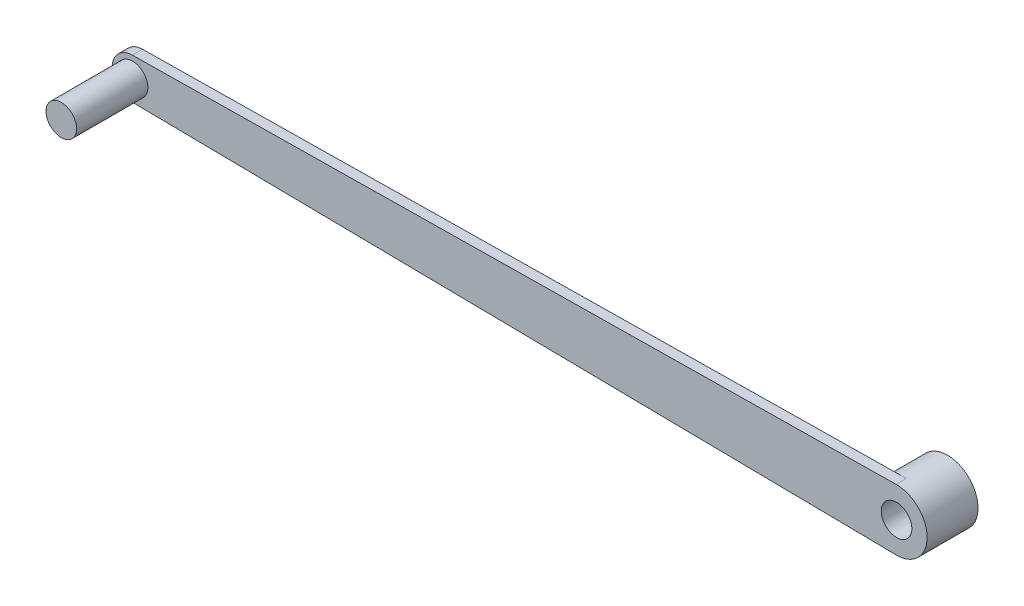
ISO-10303-21;
HEADER;
FILE_DESCRIPTION(('STEP AP214'),'2;1');
FILE_NAME('part.step','',(''),(''),'','','');
FILE_SCHEMA(('AUTOMOTIVE_DESIGN { 1 0 10303 214 1 1 1 1 }'));
ENDSEC;
DATA;
#1=APPLICATION_CONTEXT('core data for automotive mechanical design processes');
#2=APPLICATION_PROTOCOL_DEFINITION('international standard','automotive_design',2000,#1);
#3=PRODUCT_CONTEXT('',#1,'mechanical');
#4=PRODUCT('Part','Part','',(#3));
#5=PRODUCT_RELATED_PRODUCT_CATEGORY('part','',(#4));
#6=PRODUCT_DEFINITION_FORMATION('','',#4);
#7=PRODUCT_DEFINITION_CONTEXT('part definition',#1,'design');
#8=PRODUCT_DEFINITION('design','',#6,#7);
#9=PRODUCT_DEFINITION_SHAPE('','',#8);
#10=(LENGTH_UNIT() NAMED_UNIT(*) SI_UNIT(.MILLI.,.METRE.));
#11=(NAMED_UNIT(*) PLANE_ANGLE_UNIT() SI_UNIT($,.RADIAN.));
#12=(NAMED_UNIT(*) SI_UNIT($,.STERADIAN.) SOLID_ANGLE_UNIT());
#13=UNCERTAINTY_MEASURE_WITH_UNIT(LENGTH_MEASURE(1.E-05),#10,'distance_accuracy_value','');
#14=(GEOMETRIC_REPRESENTATION_CONTEXT(3) GLOBAL_UNCERTAINTY_ASSIGNED_CONTEXT((#13)) GLOBAL_UNIT_ASSIGNED_CONTEXT((#10,
#11,#12)) REPRESENTATION_CONTEXT('',''));
#15=CARTESIAN_POINT('',(0.,0.,0.));
#16=DIRECTION('',(0.,0.,1.));
#17=DIRECTION('',(1.,0.,0.));
#18=AXIS2_PLACEMENT_3D('',#15,#16,#17);
#19=CARTESIAN_POINT('',(-77.46176,-3.035730121,0.));
#20=DIRECTION('',(0.,0.,1.));
#21=DIRECTION('',(1.,0.,0.));
#22=AXIS2_PLACEMENT_3D('',#19,#20,#21);
#23=PLANE('',#22);
#24=DIRECTION('',(-0.999911107160172,0.013333333331139,0.));
#25=VECTOR('',#24,1.);
#26=CARTESIAN_POINT('',(-37.5333333335,-2.4997777675,0.));
#27=LINE('',#26,#25);
#28=CARTESIAN_POINT('',(-0.0400000002764414,-2.99973332123653,0.));
#29=VERTEX_POINT('',#28);
#30=CARTESIAN_POINT('',(-75.0266666668291,-1.99982221400228,0.));
#31=VERTEX_POINT('',#30);
#32=EDGE_CURVE('E66',#29,#31,#27,.T.);
#33=ORIENTED_EDGE('',*,*,#32,.T.);
#34=CARTESIAN_POINT('',(-75.,0.,0.));
#35=DIRECTION('',(0.,0.,-1.));
#36=DIRECTION('',(-1.,0.,0.));
#37=AXIS2_PLACEMENT_3D('',#34,#35,#36);
#38=CIRCLE('',#37,2.);
#39=CARTESIAN_POINT('',(-75.026666666829,1.99982221400228,0.));
#40=VERTEX_POINT('',#39);
#41=EDGE_CURVE('E21',#31,#40,#38,.T.);
#42=ORIENTED_EDGE('',*,*,#41,.T.);
#43=DIRECTION('',(0.999911107160172,0.013333333331139,0.));
#44=VECTOR('',#43,1.);
#45=CARTESIAN_POINT('',(-37.5333333335,2.4997777675,0.));
#46=LINE('',#45,#44);
#47=CARTESIAN_POINT('',(-0.039999999993506,2.99973332100009,0.));
#48=VERTEX_POINT('',#47);
#49=EDGE_CURVE('E81',#40,#48,#46,.T.);
#50=ORIENTED_EDGE('',*,*,#49,.T.);
#51=CARTESIAN_POINT('',(0.,0.,0.));
#52=DIRECTION('',(0.,0.,-1.));
#53=DIRECTION('',(-1.,0.,0.));
#54=AXIS2_PLACEMENT_3D('',#51,#52,#53);
#55=CIRCLE('',#54,3.);
#56=EDGE_CURVE('E67',#48,#29,#55,.F.);
#57=ORIENTED_EDGE('',*,*,#56,.T.);
#58=EDGE_LOOP('',(#33,#42,#50,#57));
#59=FACE_BOUND('',#58,.T.);
#60=ADVANCED_FACE('F17',(#59),#23,.F.);
#61=CARTESIAN_POINT('',(3.036,-3.036,-4.));
#62=DIRECTION('',(0.,0.,-1.));
#63=DIRECTION('',(-1.,0.,0.));
#64=AXIS2_PLACEMENT_3D('',#61,#62,#63);
#65=PLANE('',#64);
#66=CARTESIAN_POINT('',(0.,0.,-4.));
#67=DIRECTION('',(0.,0.,-1.));
#68=DIRECTION('',(-1.,0.,0.));
#69=AXIS2_PLACEMENT_3D('',#66,#67,#68);
#70=CIRCLE('',#69,1.5);
#71=CARTESIAN_POINT('',(-1.5,0.,-4.));
#72=VERTEX_POINT('',#71);
#73=EDGE_CURVE('E82',#72,#72,#70,.T.);
#74=ORIENTED_EDGE('',*,*,#73,.F.);
#75=EDGE_LOOP('',(#74));
#76=FACE_BOUND('',#75,.T.);
#77=CARTESIAN_POINT('',(0.,0.,-4.));
#78=DIRECTION('',(0.,0.,-1.));
#79=DIRECTION('',(-1.,0.,0.));
#80=AXIS2_PLACEMENT_3D('',#77,#78,#79);
#81=CIRCLE('',#80,3.);
#82=CARTESIAN_POINT('',(-3.,0.,-4.));
#83=VERTEX_POINT('',#82);
#84=EDGE_CURVE('E100',#83,#83,#81,.T.);
#85=ORIENTED_EDGE('',*,*,#84,.T.);
#86=EDGE_LOOP('',(#85));
#87=FACE_BOUND('',#86,.T.);
#88=ADVANCED_FACE('F134',(#76,#87),#65,.T.);
#89=CARTESIAN_POINT('',(-75.,0.,1.));
#90=DIRECTION('',(0.,0.,-1.));
#91=DIRECTION('',(-1.,0.,0.));
#92=AXIS2_PLACEMENT_3D('',#89,#90,#91);
#93=CYLINDRICAL_SURFACE('',#92,2.);
#94=CARTESIAN_POINT('',(-75.,0.,1.));
#95=DIRECTION('',(0.,0.,-1.));
#96=DIRECTION('',(-1.,0.,0.));
#97=AXIS2_PLACEMENT_3D('',#94,#95,#96);
#98=CIRCLE('',#97,2.);
#99=CARTESIAN_POINT('',(-75.0266666668272,1.99982221562365,1.));
#100=VERTEX_POINT('',#99);
#101=CARTESIAN_POINT('',(-75.0266666668272,-1.99982221562365,1.));
#102=VERTEX_POINT('',#101);
#103=EDGE_CURVE('E96',#100,#102,#98,.F.);
#104=ORIENTED_EDGE('',*,*,#103,.F.);
#105=DIRECTION('',(0.,0.,-1.));
#106=VECTOR('',#105,1.);
#107=CARTESIAN_POINT('',(-75.026666667,1.999822214,0.5));
#108=LINE('',#107,#106);
#109=EDGE_CURVE('E61',#100,#40,#108,.T.);
#110=ORIENTED_EDGE('',*,*,#109,.T.);
#111=ORIENTED_EDGE('',*,*,#41,.F.);
#112=DIRECTION('',(0.,0.,1.));
#113=VECTOR('',#112,1.);
#114=CARTESIAN_POINT('',(-75.026666667,-1.999822214,0.5));
#115=LINE('',#114,#113);
#116=EDGE_CURVE('E58',#31,#102,#115,.T.);
#117=ORIENTED_EDGE('',*,*,#116,.T.);
#118=EDGE_LOOP('',(#104,#110,#111,#117));
#119=FACE_BOUND('',#118,.T.);
#120=ADVANCED_FACE('F56',(#119),#93,.T.);
#121=CARTESIAN_POINT('',(-0.04,-2.999733321,0.));
#122=DIRECTION('',(0.013333333331139,0.999911107160172,0.));
#123=DIRECTION('',(-0.999911107160172,0.013333333331139,0.));
#124=AXIS2_PLACEMENT_3D('',#121,#122,#123);
#125=PLANE('',#124);
#126=DIRECTION('',(0.,0.,-1.));
#127=VECTOR('',#126,1.);
#128=CARTESIAN_POINT('',(-0.0400000005658708,-2.99973332147288,-1.5));
#129=LINE('',#128,#127);
#130=CARTESIAN_POINT('',(-0.0400000002511847,-2.99973332197927,1.));
#131=VERTEX_POINT('',#130);
#132=EDGE_CURVE('E71',#29,#131,#129,.F.);
#133=ORIENTED_EDGE('',*,*,#132,.T.);
#134=DIRECTION('',(0.999911107160484,-0.0133333333077027,0.));
#135=VECTOR('',#134,1.);
#136=CARTESIAN_POINT('',(-75.0266666912,-1.99982221692,1.));
#137=LINE('',#136,#135);
#138=EDGE_CURVE('E75',#102,#131,#137,.T.);
#139=ORIENTED_EDGE('',*,*,#138,.F.);
#140=ORIENTED_EDGE('',*,*,#116,.F.);
#141=ORIENTED_EDGE('',*,*,#32,.F.);
#142=EDGE_LOOP('',(#133,#139,#140,#141));
#143=FACE_BOUND('',#142,.T.);
#144=ADVANCED_FACE('F73',(#143),#125,.F.);
#145=CARTESIAN_POINT('',(0.,0.,1.));
#146=DIRECTION('',(0.,0.,-1.));
#147=DIRECTION('',(-1.,0.,0.));
#148=AXIS2_PLACEMENT_3D('',#145,#146,#147);
#149=CYLINDRICAL_SURFACE('',#148,3.);
#150=ORIENTED_EDGE('',*,*,#84,.F.);
#151=EDGE_LOOP('',(#150));
#152=FACE_BOUND('',#151,.T.);
#153=CARTESIAN_POINT('',(0.,0.,1.));
#154=DIRECTION('',(0.,0.,-1.));
#155=DIRECTION('',(-1.,0.,0.));
#156=AXIS2_PLACEMENT_3D('',#153,#154,#155);
#157=CIRCLE('',#156,3.);
#158=CARTESIAN_POINT('',(-0.0399999999682493,2.99973332174283,1.));
#159=VERTEX_POINT('',#158);
#160=EDGE_CURVE('E92',#131,#159,#157,.F.);
#161=ORIENTED_EDGE('',*,*,#160,.F.);
#162=ORIENTED_EDGE('',*,*,#132,.F.);
#163=ORIENTED_EDGE('',*,*,#56,.F.);
#164=DIRECTION('',(0.,0.,1.));
#165=VECTOR('',#164,1.);
#166=CARTESIAN_POINT('',(-0.04,2.999733321,0.5));
#167=LINE('',#166,#165);
#168=EDGE_CURVE('E36',#48,#159,#167,.T.);
#169=ORIENTED_EDGE('',*,*,#168,.T.);
#170=EDGE_LOOP('',(#161,#162,#163,#169));
#171=FACE_BOUND('',#170,.T.);
#172=ADVANCED_FACE('F109',(#152,#171),#149,.T.);
#173=CARTESIAN_POINT('',(-75.026666667,1.999822214,0.));
#174=DIRECTION('',(0.013333333331139,-0.999911107160172,0.));
#175=DIRECTION('',(0.999911107160172,0.013333333331139,0.));
#176=AXIS2_PLACEMENT_3D('',#173,#174,#175);
#177=PLANE('',#176);
#178=ORIENTED_EDGE('',*,*,#109,.F.);
#179=DIRECTION('',(-0.999911107160484,-0.0133333333077027,0.));
#180=VECTOR('',#179,1.);
#181=CARTESIAN_POINT('',(-0.0400000105599957,2.999733322344,1.));
#182=LINE('',#181,#180);
#183=EDGE_CURVE('E89',#159,#100,#182,.T.);
#184=ORIENTED_EDGE('',*,*,#183,.F.);
#185=ORIENTED_EDGE('',*,*,#168,.F.);
#186=ORIENTED_EDGE('',*,*,#49,.F.);
#187=EDGE_LOOP('',(#178,#184,#185,#186));
#188=FACE_BOUND('',#187,.T.);
#189=ADVANCED_FACE('F105',(#188),#177,.F.);
#190=CARTESIAN_POINT('',(0.,0.,1.));
#191=DIRECTION('',(0.,0.,-1.));
#192=DIRECTION('',(-1.,0.,0.));
#193=AXIS2_PLACEMENT_3D('',#190,#191,#192);
#194=CYLINDRICAL_SURFACE('',#193,1.5);
#195=CARTESIAN_POINT('',(0.,0.,1.));
#196=DIRECTION('',(0.,0.,-1.));
#197=DIRECTION('',(-1.,0.,0.));
#198=AXIS2_PLACEMENT_3D('',#195,#196,#197);
#199=CIRCLE('',#198,1.5);
#200=CARTESIAN_POINT('',(-1.5,0.,1.));
#201=VERTEX_POINT('',#200);
#202=EDGE_CURVE('E86',#201,#201,#199,.T.);
#203=ORIENTED_EDGE('',*,*,#202,.F.);
#204=EDGE_LOOP('',(#203));
#205=FACE_BOUND('',#204,.T.);
#206=ORIENTED_EDGE('',*,*,#73,.T.);
#207=EDGE_LOOP('',(#206));
#208=FACE_BOUND('',#207,.T.);
#209=ADVANCED_FACE('F108',(#205,#208),#194,.F.);
#210=CARTESIAN_POINT('',(-77.48,-3.036,1.));
#211=DIRECTION('',(0.,0.,1.));
#212=DIRECTION('',(1.,0.,0.));
#213=AXIS2_PLACEMENT_3D('',#210,#211,#212);
#214=PLANE('',#213);
#215=CARTESIAN_POINT('',(-75.,0.,1.));
#216=DIRECTION('',(0.,0.,-1.));
#217=DIRECTION('',(-1.,0.,0.));
#218=AXIS2_PLACEMENT_3D('',#215,#216,#217);
#219=CIRCLE('',#218,1.5);
#220=CARTESIAN_POINT('',(-76.5,0.,1.));
#221=VERTEX_POINT('',#220);
#222=EDGE_CURVE('E27',#221,#221,#219,.T.);
#223=ORIENTED_EDGE('',*,*,#222,.T.);
#224=EDGE_LOOP('',(#223));
#225=FACE_BOUND('',#224,.T.);
#226=ORIENTED_EDGE('',*,*,#202,.T.);
#227=EDGE_LOOP('',(#226));
#228=FACE_BOUND('',#227,.T.);
#229=ORIENTED_EDGE('',*,*,#160,.T.);
#230=ORIENTED_EDGE('',*,*,#183,.T.);
#231=ORIENTED_EDGE('',*,*,#103,.T.);
#232=ORIENTED_EDGE('',*,*,#138,.T.);
#233=EDGE_LOOP('',(#229,#230,#231,#232));
#234=FACE_BOUND('',#233,.T.);
#235=ADVANCED_FACE('F103',(#225,#228,#234),#214,.T.);
#236=CARTESIAN_POINT('',(-76.518,-1.518,8.));
#237=DIRECTION('',(0.,0.,1.));
#238=DIRECTION('',(1.,0.,0.));
#239=AXIS2_PLACEMENT_3D('',#236,#237,#238);
#240=PLANE('',#239);
#241=CARTESIAN_POINT('',(-75.,0.,8.));
#242=DIRECTION('',(0.,0.,-1.));
#243=DIRECTION('',(-1.,0.,0.));
#244=AXIS2_PLACEMENT_3D('',#241,#242,#243);
#245=CIRCLE('',#244,1.5);
#246=CARTESIAN_POINT('',(-76.5,0.,8.));
#247=VERTEX_POINT('',#246);
#248=EDGE_CURVE('E11',#247,#247,#245,.F.);
#249=ORIENTED_EDGE('',*,*,#248,.T.);
#250=EDGE_LOOP('',(#249));
#251=FACE_BOUND('',#250,.T.);
#252=ADVANCED_FACE('F19',(#251),#240,.T.);
#253=CARTESIAN_POINT('',(-75.,0.,8.));
#254=DIRECTION('',(0.,0.,-1.));
#255=DIRECTION('',(-1.,0.,0.));
#256=AXIS2_PLACEMENT_3D('',#253,#254,#255);
#257=CYLINDRICAL_SURFACE('',#256,1.5);
#258=ORIENTED_EDGE('',*,*,#222,.F.);
#259=EDGE_LOOP('',(#258));
#260=FACE_BOUND('',#259,.T.);
#261=ORIENTED_EDGE('',*,*,#248,.F.);
#262=EDGE_LOOP('',(#261));
#263=FACE_BOUND('',#262,.T.);
#264=ADVANCED_FACE('F121',(#260,#263),#257,.T.);
#265=CLOSED_SHELL('',(#60,#88,#120,#144,#172,#189,#209,#235,#252,#264));
#266=MANIFOLD_SOLID_BREP('B1',#265);
#267=ADVANCED_BREP_SHAPE_REPRESENTATION('',(#18,#266),#14);
#268=SHAPE_DEFINITION_REPRESENTATION(#9,#267);
ENDSEC;
END-ISO-10303-21;
